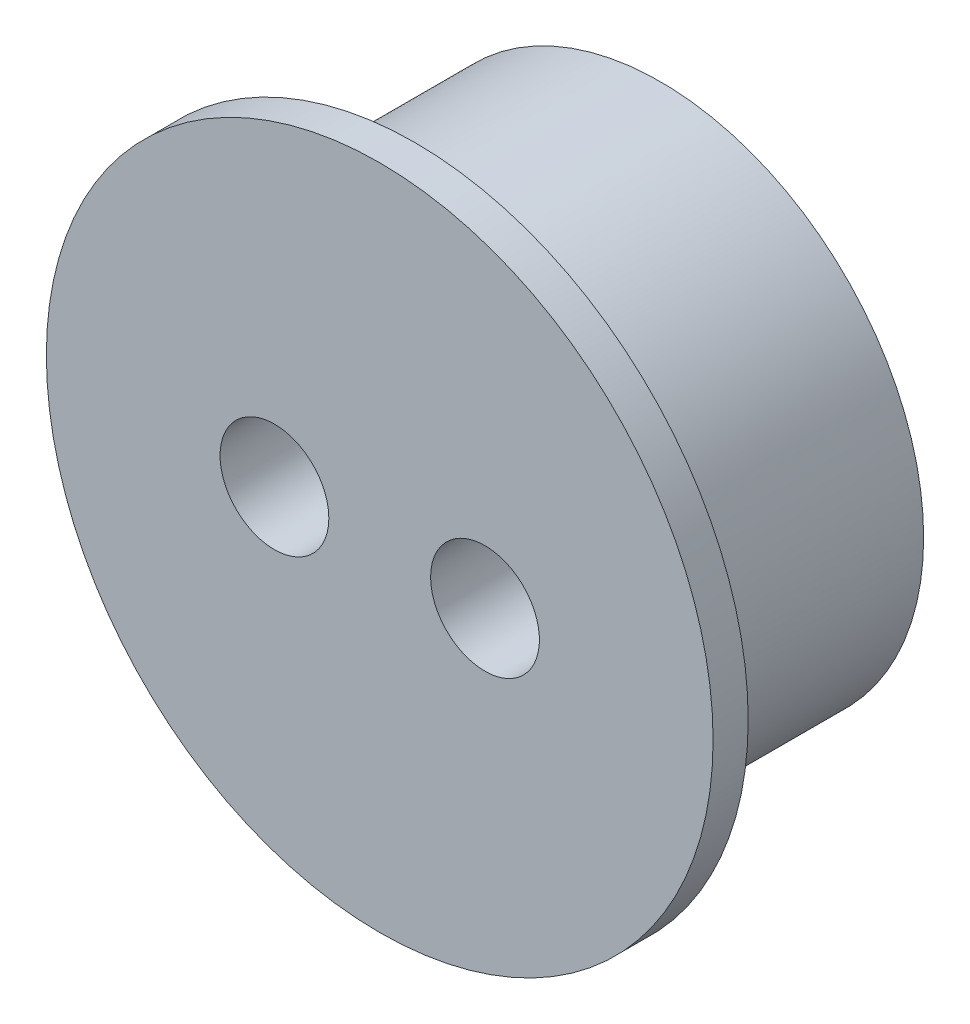
ISO-10303-21;
HEADER;
FILE_DESCRIPTION(('STEP AP214'),'2;1');
FILE_NAME('part.step','',(''),(''),'','','');
FILE_SCHEMA(('AUTOMOTIVE_DESIGN { 1 0 10303 214 1 1 1 1 }'));
ENDSEC;
DATA;
#1=APPLICATION_CONTEXT('core data for automotive mechanical design processes');
#2=APPLICATION_PROTOCOL_DEFINITION('international standard','automotive_design',2000,#1);
#3=PRODUCT_CONTEXT('',#1,'mechanical');
#4=PRODUCT('Part','Part','',(#3));
#5=PRODUCT_RELATED_PRODUCT_CATEGORY('part','',(#4));
#6=PRODUCT_DEFINITION_FORMATION('','',#4);
#7=PRODUCT_DEFINITION_CONTEXT('part definition',#1,'design');
#8=PRODUCT_DEFINITION('design','',#6,#7);
#9=PRODUCT_DEFINITION_SHAPE('','',#8);
#10=(LENGTH_UNIT() NAMED_UNIT(*) SI_UNIT(.MILLI.,.METRE.));
#11=(NAMED_UNIT(*) PLANE_ANGLE_UNIT() SI_UNIT($,.RADIAN.));
#12=(NAMED_UNIT(*) SI_UNIT($,.STERADIAN.) SOLID_ANGLE_UNIT());
#13=UNCERTAINTY_MEASURE_WITH_UNIT(LENGTH_MEASURE(1.E-05),#10,'distance_accuracy_value','');
#14=(GEOMETRIC_REPRESENTATION_CONTEXT(3) GLOBAL_UNCERTAINTY_ASSIGNED_CONTEXT((#13)) GLOBAL_UNIT_ASSIGNED_CONTEXT((#10,
#11,#12)) REPRESENTATION_CONTEXT('',''));
#15=CARTESIAN_POINT('',(0.,0.,0.));
#16=DIRECTION('',(0.,0.,1.));
#17=DIRECTION('',(1.,0.,0.));
#18=AXIS2_PLACEMENT_3D('',#15,#16,#17);
#19=CARTESIAN_POINT('',(0.,0.,7.));
#20=DIRECTION('',(0.,0.,-1.));
#21=DIRECTION('',(-1.,0.,0.));
#22=AXIS2_PLACEMENT_3D('',#19,#20,#21);
#23=CYLINDRICAL_SURFACE('',#22,7.5);
#24=CARTESIAN_POINT('',(0.,0.,7.));
#25=DIRECTION('',(0.,0.,1.));
#26=DIRECTION('',(1.,0.,0.));
#27=AXIS2_PLACEMENT_3D('',#24,#25,#26);
#28=CIRCLE('',#27,7.5);
#29=CARTESIAN_POINT('',(7.5,0.,7.));
#30=VERTEX_POINT('',#29);
#31=EDGE_CURVE('E10',#30,#30,#28,.T.);
#32=ORIENTED_EDGE('',*,*,#31,.F.);
#33=EDGE_LOOP('',(#32));
#34=FACE_BOUND('',#33,.T.);
#35=CARTESIAN_POINT('',(0.,0.,0.));
#36=DIRECTION('',(0.,0.,1.));
#37=DIRECTION('',(1.,0.,0.));
#38=AXIS2_PLACEMENT_3D('',#35,#36,#37);
#39=CIRCLE('',#38,7.5);
#40=CARTESIAN_POINT('',(7.5,0.,0.));
#41=VERTEX_POINT('',#40);
#42=EDGE_CURVE('E38',#41,#41,#39,.T.);
#43=ORIENTED_EDGE('',*,*,#42,.T.);
#44=EDGE_LOOP('',(#43));
#45=FACE_BOUND('',#44,.T.);
#46=ADVANCED_FACE('F35',(#34,#45),#23,.T.);
#47=CARTESIAN_POINT('',(0.,0.,0.));
#48=DIRECTION('',(0.,0.,1.));
#49=DIRECTION('',(1.,0.,0.));
#50=AXIS2_PLACEMENT_3D('',#47,#48,#49);
#51=PLANE('',#50);
#52=CARTESIAN_POINT('',(3.,0.,0.));
#53=DIRECTION('',(0.,0.,-1.));
#54=DIRECTION('',(-1.,0.,0.));
#55=AXIS2_PLACEMENT_3D('',#52,#53,#54);
#56=CIRCLE('',#55,1.55);
#57=CARTESIAN_POINT('',(1.45,0.,0.));
#58=VERTEX_POINT('',#57);
#59=EDGE_CURVE('E59',#58,#58,#56,.T.);
#60=ORIENTED_EDGE('',*,*,#59,.F.);
#61=EDGE_LOOP('',(#60));
#62=FACE_BOUND('',#61,.T.);
#63=CARTESIAN_POINT('',(-2.99999999999999,0.,0.));
#64=DIRECTION('',(0.,0.,-1.));
#65=DIRECTION('',(1.,0.,0.));
#66=AXIS2_PLACEMENT_3D('',#63,#64,#65);
#67=CIRCLE('',#66,1.55);
#68=CARTESIAN_POINT('',(-1.44999999999999,0.,0.));
#69=VERTEX_POINT('',#68);
#70=EDGE_CURVE('E53',#69,#69,#67,.T.);
#71=ORIENTED_EDGE('',*,*,#70,.F.);
#72=EDGE_LOOP('',(#71));
#73=FACE_BOUND('',#72,.T.);
#74=ORIENTED_EDGE('',*,*,#42,.F.);
#75=EDGE_LOOP('',(#74));
#76=FACE_BOUND('',#75,.T.);
#77=ADVANCED_FACE('F75',(#62,#73,#76),#51,.F.);
#78=CARTESIAN_POINT('',(0.,0.,8.));
#79=DIRECTION('',(0.,0.,-1.));
#80=DIRECTION('',(-1.,0.,0.));
#81=AXIS2_PLACEMENT_3D('',#78,#79,#80);
#82=CYLINDRICAL_SURFACE('',#81,9.5);
#83=CARTESIAN_POINT('',(0.,0.,8.));
#84=DIRECTION('',(0.,0.,1.));
#85=DIRECTION('',(1.,0.,0.));
#86=AXIS2_PLACEMENT_3D('',#83,#84,#85);
#87=CIRCLE('',#86,9.5);
#88=CARTESIAN_POINT('',(9.5,0.,8.));
#89=VERTEX_POINT('',#88);
#90=EDGE_CURVE('E45',#89,#89,#87,.T.);
#91=ORIENTED_EDGE('',*,*,#90,.F.);
#92=EDGE_LOOP('',(#91));
#93=FACE_BOUND('',#92,.T.);
#94=CARTESIAN_POINT('',(0.,0.,7.));
#95=DIRECTION('',(0.,0.,1.));
#96=DIRECTION('',(1.,0.,0.));
#97=AXIS2_PLACEMENT_3D('',#94,#95,#96);
#98=CIRCLE('',#97,9.5);
#99=CARTESIAN_POINT('',(9.5,0.,7.));
#100=VERTEX_POINT('',#99);
#101=EDGE_CURVE('E47',#100,#100,#98,.T.);
#102=ORIENTED_EDGE('',*,*,#101,.T.);
#103=EDGE_LOOP('',(#102));
#104=FACE_BOUND('',#103,.T.);
#105=ADVANCED_FACE('F78',(#93,#104),#82,.T.);
#106=CARTESIAN_POINT('',(0.,0.,8.));
#107=DIRECTION('',(0.,0.,1.));
#108=DIRECTION('',(1.,0.,0.));
#109=AXIS2_PLACEMENT_3D('',#106,#107,#108);
#110=PLANE('',#109);
#111=CARTESIAN_POINT('',(3.,0.,8.));
#112=DIRECTION('',(0.,0.,-1.));
#113=DIRECTION('',(-1.,0.,0.));
#114=AXIS2_PLACEMENT_3D('',#111,#112,#113);
#115=CIRCLE('',#114,1.55);
#116=CARTESIAN_POINT('',(1.45,0.,8.));
#117=VERTEX_POINT('',#116);
#118=EDGE_CURVE('E50',#117,#117,#115,.T.);
#119=ORIENTED_EDGE('',*,*,#118,.T.);
#120=EDGE_LOOP('',(#119));
#121=FACE_BOUND('',#120,.T.);
#122=CARTESIAN_POINT('',(-2.99999999999999,0.,8.));
#123=DIRECTION('',(0.,0.,-1.));
#124=DIRECTION('',(1.,0.,0.));
#125=AXIS2_PLACEMENT_3D('',#122,#123,#124);
#126=CIRCLE('',#125,1.55);
#127=CARTESIAN_POINT('',(-1.44999999999999,0.,8.));
#128=VERTEX_POINT('',#127);
#129=EDGE_CURVE('E56',#128,#128,#126,.T.);
#130=ORIENTED_EDGE('',*,*,#129,.T.);
#131=EDGE_LOOP('',(#130));
#132=FACE_BOUND('',#131,.T.);
#133=ORIENTED_EDGE('',*,*,#90,.T.);
#134=EDGE_LOOP('',(#133));
#135=FACE_BOUND('',#134,.T.);
#136=ADVANCED_FACE('F65',(#121,#132,#135),#110,.T.);
#137=CARTESIAN_POINT('',(0.,0.,7.));
#138=DIRECTION('',(0.,0.,1.));
#139=DIRECTION('',(1.,0.,0.));
#140=AXIS2_PLACEMENT_3D('',#137,#138,#139);
#141=PLANE('',#140);
#142=ORIENTED_EDGE('',*,*,#31,.T.);
#143=EDGE_LOOP('',(#142));
#144=FACE_BOUND('',#143,.T.);
#145=ORIENTED_EDGE('',*,*,#101,.F.);
#146=EDGE_LOOP('',(#145));
#147=FACE_BOUND('',#146,.T.);
#148=ADVANCED_FACE('F105',(#144,#147),#141,.F.);
#149=CARTESIAN_POINT('',(-2.99999999999999,0.,8.));
#150=DIRECTION('',(0.,0.,-1.));
#151=DIRECTION('',(-1.,0.,0.));
#152=AXIS2_PLACEMENT_3D('',#149,#150,#151);
#153=CYLINDRICAL_SURFACE('',#152,1.55);
#154=ORIENTED_EDGE('',*,*,#129,.F.);
#155=EDGE_LOOP('',(#154));
#156=FACE_BOUND('',#155,.T.);
#157=ORIENTED_EDGE('',*,*,#70,.T.);
#158=EDGE_LOOP('',(#157));
#159=FACE_BOUND('',#158,.T.);
#160=ADVANCED_FACE('F71',(#156,#159),#153,.F.);
#161=CARTESIAN_POINT('',(3.,0.,8.));
#162=DIRECTION('',(0.,0.,-1.));
#163=DIRECTION('',(-1.,0.,0.));
#164=AXIS2_PLACEMENT_3D('',#161,#162,#163);
#165=CYLINDRICAL_SURFACE('',#164,1.55);
#166=ORIENTED_EDGE('',*,*,#118,.F.);
#167=EDGE_LOOP('',(#166));
#168=FACE_BOUND('',#167,.T.);
#169=ORIENTED_EDGE('',*,*,#59,.T.);
#170=EDGE_LOOP('',(#169));
#171=FACE_BOUND('',#170,.T.);
#172=ADVANCED_FACE('F68',(#168,#171),#165,.F.);
#173=CLOSED_SHELL('',(#46,#77,#105,#136,#148,#160,#172));
#174=MANIFOLD_SOLID_BREP('B2',#173);
#175=ADVANCED_BREP_SHAPE_REPRESENTATION('',(#18,#174),#14);
#176=SHAPE_DEFINITION_REPRESENTATION(#9,#175);
ENDSEC;
END-ISO-10303-21;
